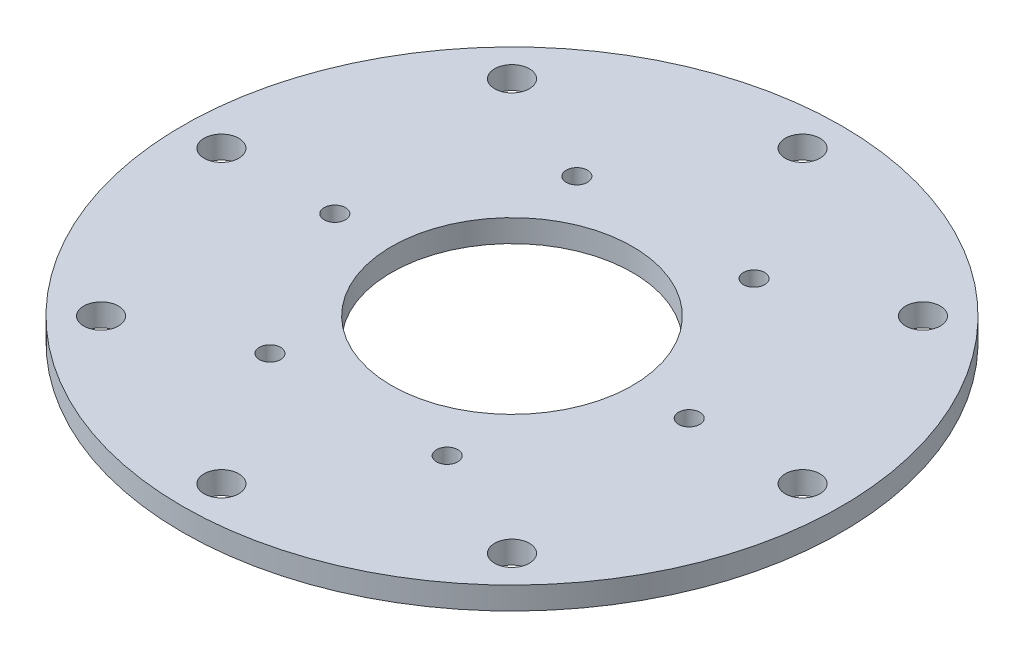
ISO-10303-21;
HEADER;
FILE_DESCRIPTION(('STEP AP214'),'2;1');
FILE_NAME('part.step','',(''),(''),'','','');
FILE_SCHEMA(('AUTOMOTIVE_DESIGN { 1 0 10303 214 1 1 1 1 }'));
ENDSEC;
DATA;
#1=APPLICATION_CONTEXT('core data for automotive mechanical design processes');
#2=APPLICATION_PROTOCOL_DEFINITION('international standard','automotive_design',2000,#1);
#3=PRODUCT_CONTEXT('',#1,'mechanical');
#4=PRODUCT('Part','Part','',(#3));
#5=PRODUCT_RELATED_PRODUCT_CATEGORY('part','',(#4));
#6=PRODUCT_DEFINITION_FORMATION('','',#4);
#7=PRODUCT_DEFINITION_CONTEXT('part definition',#1,'design');
#8=PRODUCT_DEFINITION('design','',#6,#7);
#9=PRODUCT_DEFINITION_SHAPE('','',#8);
#10=(LENGTH_UNIT() NAMED_UNIT(*) SI_UNIT(.MILLI.,.METRE.));
#11=(NAMED_UNIT(*) PLANE_ANGLE_UNIT() SI_UNIT($,.RADIAN.));
#12=(NAMED_UNIT(*) SI_UNIT($,.STERADIAN.) SOLID_ANGLE_UNIT());
#13=UNCERTAINTY_MEASURE_WITH_UNIT(LENGTH_MEASURE(1.E-05),#10,'distance_accuracy_value','');
#14=(GEOMETRIC_REPRESENTATION_CONTEXT(3) GLOBAL_UNCERTAINTY_ASSIGNED_CONTEXT((#13)) GLOBAL_UNIT_ASSIGNED_CONTEXT((#10,
#11,#12)) REPRESENTATION_CONTEXT('',''));
#15=CARTESIAN_POINT('',(0.,0.,0.));
#16=DIRECTION('',(0.,0.,1.));
#17=DIRECTION('',(1.,0.,0.));
#18=AXIS2_PLACEMENT_3D('',#15,#16,#17);
#19=CARTESIAN_POINT('',(0.,3.175,0.));
#20=DIRECTION('',(0.,1.,0.));
#21=DIRECTION('',(0.,0.,1.));
#22=AXIS2_PLACEMENT_3D('',#19,#20,#21);
#23=PLANE('',#22);
#24=CARTESIAN_POINT('',(-4.23328039289572E-13,3.175,41.));
#25=DIRECTION('',(0.,1.,0.));
#26=DIRECTION('',(0.,0.,1.));
#27=AXIS2_PLACEMENT_3D('',#24,#25,#26);
#28=CIRCLE('',#27,2.45);
#29=CARTESIAN_POINT('',(-4.23328039289572E-13,3.175,43.45));
#30=VERTEX_POINT('',#29);
#31=EDGE_CURVE('E122',#30,#30,#28,.T.);
#32=ORIENTED_EDGE('',*,*,#31,.F.);
#33=EDGE_LOOP('',(#32));
#34=FACE_BOUND('',#33,.T.);
#35=CARTESIAN_POINT('',(41.,3.175,2.84494650060196E-13));
#36=DIRECTION('',(0.,1.,0.));
#37=DIRECTION('',(0.,0.,1.));
#38=AXIS2_PLACEMENT_3D('',#35,#36,#37);
#39=CIRCLE('',#38,2.45);
#40=CARTESIAN_POINT('',(41.,3.175,2.45000000000028));
#41=VERTEX_POINT('',#40);
#42=EDGE_CURVE('E110',#41,#41,#39,.T.);
#43=ORIENTED_EDGE('',*,*,#42,.F.);
#44=EDGE_LOOP('',(#43));
#45=FACE_BOUND('',#44,.T.);
#46=CARTESIAN_POINT('',(7.14706072102445E-13,3.175,-41.));
#47=DIRECTION('',(0.,1.,0.));
#48=DIRECTION('',(0.,0.,1.));
#49=AXIS2_PLACEMENT_3D('',#46,#47,#48);
#50=CIRCLE('',#49,2.45);
#51=CARTESIAN_POINT('',(7.14706072102445E-13,3.175,-38.55));
#52=VERTEX_POINT('',#51);
#53=EDGE_CURVE('E98',#52,#52,#50,.T.);
#54=ORIENTED_EDGE('',*,*,#53,.F.);
#55=EDGE_LOOP('',(#54));
#56=FACE_BOUND('',#55,.T.);
#57=CARTESIAN_POINT('',(12.4999999999998,3.175,21.6506350946111));
#58=DIRECTION('',(0.,1.,0.));
#59=DIRECTION('',(0.,0.,1.));
#60=AXIS2_PLACEMENT_3D('',#57,#58,#59);
#61=CIRCLE('',#60,1.5);
#62=CARTESIAN_POINT('',(12.4999999999998,3.175,23.1506350946111));
#63=VERTEX_POINT('',#62);
#64=EDGE_CURVE('E86',#63,#63,#61,.T.);
#65=ORIENTED_EDGE('',*,*,#64,.F.);
#66=EDGE_LOOP('',(#65));
#67=FACE_BOUND('',#66,.T.);
#68=CARTESIAN_POINT('',(12.5000000000001,3.175,-21.6506350946109));
#69=DIRECTION('',(0.,1.,0.));
#70=DIRECTION('',(0.,0.,1.));
#71=AXIS2_PLACEMENT_3D('',#68,#69,#70);
#72=CIRCLE('',#71,1.5);
#73=CARTESIAN_POINT('',(12.5000000000001,3.175,-20.1506350946109));
#74=VERTEX_POINT('',#73);
#75=EDGE_CURVE('E74',#74,#74,#72,.T.);
#76=ORIENTED_EDGE('',*,*,#75,.F.);
#77=EDGE_LOOP('',(#76));
#78=FACE_BOUND('',#77,.T.);
#79=CARTESIAN_POINT('',(-28.991378028648,3.175,-28.9913780286489));
#80=DIRECTION('',(0.,1.,0.));
#81=DIRECTION('',(0.,0.,1.));
#82=AXIS2_PLACEMENT_3D('',#79,#80,#81);
#83=CIRCLE('',#82,2.45);
#84=CARTESIAN_POINT('',(-28.991378028648,3.175,-26.5413780286489));
#85=VERTEX_POINT('',#84);
#86=EDGE_CURVE('E62',#85,#85,#83,.T.);
#87=ORIENTED_EDGE('',*,*,#86,.F.);
#88=EDGE_LOOP('',(#87));
#89=FACE_BOUND('',#88,.T.);
#90=CARTESIAN_POINT('',(-41.,3.175,0.));
#91=DIRECTION('',(0.,1.,0.));
#92=DIRECTION('',(0.,0.,1.));
#93=AXIS2_PLACEMENT_3D('',#90,#91,#92);
#94=CIRCLE('',#93,2.45);
#95=CARTESIAN_POINT('',(-41.,3.175,2.45));
#96=VERTEX_POINT('',#95);
#97=EDGE_CURVE('E50',#96,#96,#94,.T.);
#98=ORIENTED_EDGE('',*,*,#97,.F.);
#99=EDGE_LOOP('',(#98));
#100=FACE_BOUND('',#99,.T.);
#101=CARTESIAN_POINT('',(0.,3.175,0.));
#102=DIRECTION('',(0.,1.,0.));
#103=DIRECTION('',(0.,0.,1.));
#104=AXIS2_PLACEMENT_3D('',#101,#102,#103);
#105=CIRCLE('',#104,46.5);
#106=CARTESIAN_POINT('',(0.,3.175,46.5));
#107=VERTEX_POINT('',#106);
#108=EDGE_CURVE('E10',#107,#107,#105,.T.);
#109=ORIENTED_EDGE('',*,*,#108,.T.);
#110=EDGE_LOOP('',(#109));
#111=FACE_BOUND('',#110,.T.);
#112=CARTESIAN_POINT('',(0.,3.175,0.));
#113=DIRECTION('',(0.,1.,0.));
#114=DIRECTION('',(0.,0.,1.));
#115=AXIS2_PLACEMENT_3D('',#112,#113,#114);
#116=CIRCLE('',#115,17.);
#117=CARTESIAN_POINT('',(0.,3.175,17.));
#118=VERTEX_POINT('',#117);
#119=EDGE_CURVE('E45',#118,#118,#116,.T.);
#120=ORIENTED_EDGE('',*,*,#119,.F.);
#121=EDGE_LOOP('',(#120));
#122=FACE_BOUND('',#121,.T.);
#123=CARTESIAN_POINT('',(-25.,3.175,0.));
#124=DIRECTION('',(0.,1.,0.));
#125=DIRECTION('',(0.,0.,1.));
#126=AXIS2_PLACEMENT_3D('',#123,#124,#125);
#127=CIRCLE('',#126,1.5);
#128=CARTESIAN_POINT('',(-25.,3.175,1.5));
#129=VERTEX_POINT('',#128);
#130=EDGE_CURVE('E56',#129,#129,#127,.T.);
#131=ORIENTED_EDGE('',*,*,#130,.F.);
#132=EDGE_LOOP('',(#131));
#133=FACE_BOUND('',#132,.T.);
#134=CARTESIAN_POINT('',(-12.5,3.175,-21.650635094611));
#135=DIRECTION('',(0.,1.,0.));
#136=DIRECTION('',(0.,0.,1.));
#137=AXIS2_PLACEMENT_3D('',#134,#135,#136);
#138=CIRCLE('',#137,1.50000000000002);
#139=CARTESIAN_POINT('',(-12.5,3.175,-20.1506350946109));
#140=VERTEX_POINT('',#139);
#141=EDGE_CURVE('E68',#140,#140,#138,.T.);
#142=ORIENTED_EDGE('',*,*,#141,.F.);
#143=EDGE_LOOP('',(#142));
#144=FACE_BOUND('',#143,.T.);
#145=CARTESIAN_POINT('',(25.,3.175,1.74574066942157E-13));
#146=DIRECTION('',(0.,1.,0.));
#147=DIRECTION('',(0.,0.,1.));
#148=AXIS2_PLACEMENT_3D('',#145,#146,#147);
#149=CIRCLE('',#148,1.5);
#150=CARTESIAN_POINT('',(25.,3.175,1.50000000000018));
#151=VERTEX_POINT('',#150);
#152=EDGE_CURVE('E80',#151,#151,#149,.T.);
#153=ORIENTED_EDGE('',*,*,#152,.F.);
#154=EDGE_LOOP('',(#153));
#155=FACE_BOUND('',#154,.T.);
#156=CARTESIAN_POINT('',(-12.5,3.175,21.650635094611));
#157=DIRECTION('',(0.,1.,0.));
#158=DIRECTION('',(0.,0.,1.));
#159=AXIS2_PLACEMENT_3D('',#156,#157,#158);
#160=CIRCLE('',#159,1.50000000000009);
#161=CARTESIAN_POINT('',(-12.5,3.175,23.1506350946111));
#162=VERTEX_POINT('',#161);
#163=EDGE_CURVE('E92',#162,#162,#160,.T.);
#164=ORIENTED_EDGE('',*,*,#163,.F.);
#165=EDGE_LOOP('',(#164));
#166=FACE_BOUND('',#165,.T.);
#167=CARTESIAN_POINT('',(28.9913780286486,3.175,-28.9913780286483));
#168=DIRECTION('',(0.,1.,0.));
#169=DIRECTION('',(0.,0.,1.));
#170=AXIS2_PLACEMENT_3D('',#167,#168,#169);
#171=CIRCLE('',#170,2.44999999999999);
#172=CARTESIAN_POINT('',(28.9913780286486,3.175,-26.5413780286483));
#173=VERTEX_POINT('',#172);
#174=EDGE_CURVE('E104',#173,#173,#171,.T.);
#175=ORIENTED_EDGE('',*,*,#174,.F.);
#176=EDGE_LOOP('',(#175));
#177=FACE_BOUND('',#176,.T.);
#178=CARTESIAN_POINT('',(28.9913780286485,3.175,28.9913780286484));
#179=DIRECTION('',(0.,1.,0.));
#180=DIRECTION('',(0.,0.,1.));
#181=AXIS2_PLACEMENT_3D('',#178,#179,#180);
#182=CIRCLE('',#181,2.44999999999999);
#183=CARTESIAN_POINT('',(28.9913780286485,3.175,31.4413780286484));
#184=VERTEX_POINT('',#183);
#185=EDGE_CURVE('E116',#184,#184,#182,.T.);
#186=ORIENTED_EDGE('',*,*,#185,.F.);
#187=EDGE_LOOP('',(#186));
#188=FACE_BOUND('',#187,.T.);
#189=CARTESIAN_POINT('',(-28.9913780286488,3.175,28.9913780286481));
#190=DIRECTION('',(0.,1.,0.));
#191=DIRECTION('',(0.,0.,1.));
#192=AXIS2_PLACEMENT_3D('',#189,#190,#191);
#193=CIRCLE('',#192,2.45);
#194=CARTESIAN_POINT('',(-28.9913780286488,3.175,31.4413780286481));
#195=VERTEX_POINT('',#194);
#196=EDGE_CURVE('E128',#195,#195,#193,.T.);
#197=ORIENTED_EDGE('',*,*,#196,.F.);
#198=EDGE_LOOP('',(#197));
#199=FACE_BOUND('',#198,.T.);
#200=ADVANCED_FACE('F34',(#34,#45,#56,#67,#78,#89,#100,#111,#122,#133,#144,#155,#166,#177,#188,
#199),#23,.T.);
#201=CARTESIAN_POINT('',(0.,0.,0.));
#202=DIRECTION('',(0.,1.,0.));
#203=DIRECTION('',(0.,0.,1.));
#204=AXIS2_PLACEMENT_3D('',#201,#202,#203);
#205=PLANE('',#204);
#206=CARTESIAN_POINT('',(0.,0.,0.));
#207=DIRECTION('',(0.,1.,0.));
#208=DIRECTION('',(0.,0.,1.));
#209=AXIS2_PLACEMENT_3D('',#206,#207,#208);
#210=CIRCLE('',#209,46.5);
#211=CARTESIAN_POINT('',(0.,0.,46.5));
#212=VERTEX_POINT('',#211);
#213=EDGE_CURVE('E38',#212,#212,#210,.T.);
#214=ORIENTED_EDGE('',*,*,#213,.F.);
#215=EDGE_LOOP('',(#214));
#216=FACE_BOUND('',#215,.T.);
#217=CARTESIAN_POINT('',(0.,0.,0.));
#218=DIRECTION('',(0.,1.,0.));
#219=DIRECTION('',(0.,0.,1.));
#220=AXIS2_PLACEMENT_3D('',#217,#218,#219);
#221=CIRCLE('',#220,17.);
#222=CARTESIAN_POINT('',(0.,0.,17.));
#223=VERTEX_POINT('',#222);
#224=EDGE_CURVE('E47',#223,#223,#221,.T.);
#225=ORIENTED_EDGE('',*,*,#224,.T.);
#226=EDGE_LOOP('',(#225));
#227=FACE_BOUND('',#226,.T.);
#228=CARTESIAN_POINT('',(-41.,0.,0.));
#229=DIRECTION('',(0.,1.,0.));
#230=DIRECTION('',(0.,0.,1.));
#231=AXIS2_PLACEMENT_3D('',#228,#229,#230);
#232=CIRCLE('',#231,2.45);
#233=CARTESIAN_POINT('',(-41.,0.,2.45));
#234=VERTEX_POINT('',#233);
#235=EDGE_CURVE('E53',#234,#234,#232,.T.);
#236=ORIENTED_EDGE('',*,*,#235,.T.);
#237=EDGE_LOOP('',(#236));
#238=FACE_BOUND('',#237,.T.);
#239=CARTESIAN_POINT('',(-25.,0.,0.));
#240=DIRECTION('',(0.,1.,0.));
#241=DIRECTION('',(0.,0.,1.));
#242=AXIS2_PLACEMENT_3D('',#239,#240,#241);
#243=CIRCLE('',#242,1.5);
#244=CARTESIAN_POINT('',(-25.,0.,1.5));
#245=VERTEX_POINT('',#244);
#246=EDGE_CURVE('E59',#245,#245,#243,.T.);
#247=ORIENTED_EDGE('',*,*,#246,.T.);
#248=EDGE_LOOP('',(#247));
#249=FACE_BOUND('',#248,.T.);
#250=CARTESIAN_POINT('',(-28.991378028648,0.,-28.9913780286489));
#251=DIRECTION('',(0.,1.,0.));
#252=DIRECTION('',(0.,0.,1.));
#253=AXIS2_PLACEMENT_3D('',#250,#251,#252);
#254=CIRCLE('',#253,2.45);
#255=CARTESIAN_POINT('',(-28.991378028648,0.,-26.5413780286489));
#256=VERTEX_POINT('',#255);
#257=EDGE_CURVE('E65',#256,#256,#254,.T.);
#258=ORIENTED_EDGE('',*,*,#257,.T.);
#259=EDGE_LOOP('',(#258));
#260=FACE_BOUND('',#259,.T.);
#261=CARTESIAN_POINT('',(-12.5,0.,-21.650635094611));
#262=DIRECTION('',(0.,1.,0.));
#263=DIRECTION('',(0.,0.,1.));
#264=AXIS2_PLACEMENT_3D('',#261,#262,#263);
#265=CIRCLE('',#264,1.50000000000002);
#266=CARTESIAN_POINT('',(-12.5,0.,-20.1506350946109));
#267=VERTEX_POINT('',#266);
#268=EDGE_CURVE('E71',#267,#267,#265,.T.);
#269=ORIENTED_EDGE('',*,*,#268,.T.);
#270=EDGE_LOOP('',(#269));
#271=FACE_BOUND('',#270,.T.);
#272=CARTESIAN_POINT('',(12.5000000000001,0.,-21.6506350946109));
#273=DIRECTION('',(0.,1.,0.));
#274=DIRECTION('',(0.,0.,1.));
#275=AXIS2_PLACEMENT_3D('',#272,#273,#274);
#276=CIRCLE('',#275,1.5);
#277=CARTESIAN_POINT('',(12.5000000000001,0.,-20.1506350946109));
#278=VERTEX_POINT('',#277);
#279=EDGE_CURVE('E77',#278,#278,#276,.T.);
#280=ORIENTED_EDGE('',*,*,#279,.T.);
#281=EDGE_LOOP('',(#280));
#282=FACE_BOUND('',#281,.T.);
#283=CARTESIAN_POINT('',(25.,0.,1.74574066942157E-13));
#284=DIRECTION('',(0.,1.,0.));
#285=DIRECTION('',(0.,0.,1.));
#286=AXIS2_PLACEMENT_3D('',#283,#284,#285);
#287=CIRCLE('',#286,1.5);
#288=CARTESIAN_POINT('',(25.,0.,1.50000000000018));
#289=VERTEX_POINT('',#288);
#290=EDGE_CURVE('E83',#289,#289,#287,.T.);
#291=ORIENTED_EDGE('',*,*,#290,.T.);
#292=EDGE_LOOP('',(#291));
#293=FACE_BOUND('',#292,.T.);
#294=CARTESIAN_POINT('',(12.4999999999998,0.,21.6506350946111));
#295=DIRECTION('',(0.,1.,0.));
#296=DIRECTION('',(0.,0.,1.));
#297=AXIS2_PLACEMENT_3D('',#294,#295,#296);
#298=CIRCLE('',#297,1.5);
#299=CARTESIAN_POINT('',(12.4999999999998,0.,23.1506350946111));
#300=VERTEX_POINT('',#299);
#301=EDGE_CURVE('E89',#300,#300,#298,.T.);
#302=ORIENTED_EDGE('',*,*,#301,.T.);
#303=EDGE_LOOP('',(#302));
#304=FACE_BOUND('',#303,.T.);
#305=CARTESIAN_POINT('',(-12.5,0.,21.650635094611));
#306=DIRECTION('',(0.,1.,0.));
#307=DIRECTION('',(0.,0.,1.));
#308=AXIS2_PLACEMENT_3D('',#305,#306,#307);
#309=CIRCLE('',#308,1.50000000000009);
#310=CARTESIAN_POINT('',(-12.5,0.,23.1506350946111));
#311=VERTEX_POINT('',#310);
#312=EDGE_CURVE('E95',#311,#311,#309,.T.);
#313=ORIENTED_EDGE('',*,*,#312,.T.);
#314=EDGE_LOOP('',(#313));
#315=FACE_BOUND('',#314,.T.);
#316=CARTESIAN_POINT('',(7.14706072102445E-13,0.,-41.));
#317=DIRECTION('',(0.,1.,0.));
#318=DIRECTION('',(0.,0.,1.));
#319=AXIS2_PLACEMENT_3D('',#316,#317,#318);
#320=CIRCLE('',#319,2.45);
#321=CARTESIAN_POINT('',(7.14706072102445E-13,0.,-38.55));
#322=VERTEX_POINT('',#321);
#323=EDGE_CURVE('E101',#322,#322,#320,.T.);
#324=ORIENTED_EDGE('',*,*,#323,.T.);
#325=EDGE_LOOP('',(#324));
#326=FACE_BOUND('',#325,.T.);
#327=CARTESIAN_POINT('',(28.9913780286486,0.,-28.9913780286483));
#328=DIRECTION('',(0.,1.,0.));
#329=DIRECTION('',(0.,0.,1.));
#330=AXIS2_PLACEMENT_3D('',#327,#328,#329);
#331=CIRCLE('',#330,2.44999999999999);
#332=CARTESIAN_POINT('',(28.9913780286486,0.,-26.5413780286483));
#333=VERTEX_POINT('',#332);
#334=EDGE_CURVE('E107',#333,#333,#331,.T.);
#335=ORIENTED_EDGE('',*,*,#334,.T.);
#336=EDGE_LOOP('',(#335));
#337=FACE_BOUND('',#336,.T.);
#338=CARTESIAN_POINT('',(41.,0.,2.84494650060196E-13));
#339=DIRECTION('',(0.,1.,0.));
#340=DIRECTION('',(0.,0.,1.));
#341=AXIS2_PLACEMENT_3D('',#338,#339,#340);
#342=CIRCLE('',#341,2.45);
#343=CARTESIAN_POINT('',(41.,0.,2.45000000000028));
#344=VERTEX_POINT('',#343);
#345=EDGE_CURVE('E113',#344,#344,#342,.T.);
#346=ORIENTED_EDGE('',*,*,#345,.T.);
#347=EDGE_LOOP('',(#346));
#348=FACE_BOUND('',#347,.T.);
#349=CARTESIAN_POINT('',(28.9913780286485,0.,28.9913780286484));
#350=DIRECTION('',(0.,1.,0.));
#351=DIRECTION('',(0.,0.,1.));
#352=AXIS2_PLACEMENT_3D('',#349,#350,#351);
#353=CIRCLE('',#352,2.44999999999999);
#354=CARTESIAN_POINT('',(28.9913780286485,0.,31.4413780286484));
#355=VERTEX_POINT('',#354);
#356=EDGE_CURVE('E119',#355,#355,#353,.T.);
#357=ORIENTED_EDGE('',*,*,#356,.T.);
#358=EDGE_LOOP('',(#357));
#359=FACE_BOUND('',#358,.T.);
#360=CARTESIAN_POINT('',(-4.23328039289572E-13,0.,41.));
#361=DIRECTION('',(0.,1.,0.));
#362=DIRECTION('',(0.,0.,1.));
#363=AXIS2_PLACEMENT_3D('',#360,#361,#362);
#364=CIRCLE('',#363,2.45);
#365=CARTESIAN_POINT('',(-4.23328039289572E-13,0.,43.45));
#366=VERTEX_POINT('',#365);
#367=EDGE_CURVE('E125',#366,#366,#364,.T.);
#368=ORIENTED_EDGE('',*,*,#367,.T.);
#369=EDGE_LOOP('',(#368));
#370=FACE_BOUND('',#369,.T.);
#371=CARTESIAN_POINT('',(-28.9913780286488,0.,28.9913780286481));
#372=DIRECTION('',(0.,1.,0.));
#373=DIRECTION('',(0.,0.,1.));
#374=AXIS2_PLACEMENT_3D('',#371,#372,#373);
#375=CIRCLE('',#374,2.45);
#376=CARTESIAN_POINT('',(-28.9913780286488,0.,31.4413780286481));
#377=VERTEX_POINT('',#376);
#378=EDGE_CURVE('E131',#377,#377,#375,.T.);
#379=ORIENTED_EDGE('',*,*,#378,.T.);
#380=EDGE_LOOP('',(#379));
#381=FACE_BOUND('',#380,.T.);
#382=ADVANCED_FACE('F141',(#216,#227,#238,#249,#260,#271,#282,#293,#304,#315,#326,#337,#348,
#359,#370,#381),#205,.F.);
#383=CARTESIAN_POINT('',(0.,3.175,0.));
#384=DIRECTION('',(0.,-1.,0.));
#385=DIRECTION('',(0.,0.,-1.));
#386=AXIS2_PLACEMENT_3D('',#383,#384,#385);
#387=CYLINDRICAL_SURFACE('',#386,46.5);
#388=ORIENTED_EDGE('',*,*,#108,.F.);
#389=EDGE_LOOP('',(#388));
#390=FACE_BOUND('',#389,.T.);
#391=ORIENTED_EDGE('',*,*,#213,.T.);
#392=EDGE_LOOP('',(#391));
#393=FACE_BOUND('',#392,.T.);
#394=ADVANCED_FACE('F36',(#390,#393),#387,.T.);
#395=CARTESIAN_POINT('',(0.,3.175,0.));
#396=DIRECTION('',(0.,-1.,0.));
#397=DIRECTION('',(0.,0.,-1.));
#398=AXIS2_PLACEMENT_3D('',#395,#396,#397);
#399=CYLINDRICAL_SURFACE('',#398,17.);
#400=ORIENTED_EDGE('',*,*,#119,.T.);
#401=EDGE_LOOP('',(#400));
#402=FACE_BOUND('',#401,.T.);
#403=ORIENTED_EDGE('',*,*,#224,.F.);
#404=EDGE_LOOP('',(#403));
#405=FACE_BOUND('',#404,.T.);
#406=ADVANCED_FACE('F151',(#402,#405),#399,.F.);
#407=CARTESIAN_POINT('',(-41.,3.175,0.));
#408=DIRECTION('',(0.,-1.,0.));
#409=DIRECTION('',(0.,0.,-1.));
#410=AXIS2_PLACEMENT_3D('',#407,#408,#409);
#411=CYLINDRICAL_SURFACE('',#410,2.45);
#412=ORIENTED_EDGE('',*,*,#97,.T.);
#413=EDGE_LOOP('',(#412));
#414=FACE_BOUND('',#413,.T.);
#415=ORIENTED_EDGE('',*,*,#235,.F.);
#416=EDGE_LOOP('',(#415));
#417=FACE_BOUND('',#416,.T.);
#418=ADVANCED_FACE('F154',(#414,#417),#411,.F.);
#419=CARTESIAN_POINT('',(-25.,3.175,0.));
#420=DIRECTION('',(0.,-1.,0.));
#421=DIRECTION('',(0.,0.,-1.));
#422=AXIS2_PLACEMENT_3D('',#419,#420,#421);
#423=CYLINDRICAL_SURFACE('',#422,1.5);
#424=ORIENTED_EDGE('',*,*,#130,.T.);
#425=EDGE_LOOP('',(#424));
#426=FACE_BOUND('',#425,.T.);
#427=ORIENTED_EDGE('',*,*,#246,.F.);
#428=EDGE_LOOP('',(#427));
#429=FACE_BOUND('',#428,.T.);
#430=ADVANCED_FACE('F158',(#426,#429),#423,.F.);
#431=CARTESIAN_POINT('',(-28.991378028648,3.175,-28.9913780286489));
#432=DIRECTION('',(0.,-1.,0.));
#433=DIRECTION('',(0.,0.,-1.));
#434=AXIS2_PLACEMENT_3D('',#431,#432,#433);
#435=CYLINDRICAL_SURFACE('',#434,2.45);
#436=ORIENTED_EDGE('',*,*,#86,.T.);
#437=EDGE_LOOP('',(#436));
#438=FACE_BOUND('',#437,.T.);
#439=ORIENTED_EDGE('',*,*,#257,.F.);
#440=EDGE_LOOP('',(#439));
#441=FACE_BOUND('',#440,.T.);
#442=ADVANCED_FACE('F162',(#438,#441),#435,.F.);
#443=CARTESIAN_POINT('',(-12.5,3.175,-21.650635094611));
#444=DIRECTION('',(0.,-1.,0.));
#445=DIRECTION('',(0.,0.,-1.));
#446=AXIS2_PLACEMENT_3D('',#443,#444,#445);
#447=CYLINDRICAL_SURFACE('',#446,1.50000000000002);
#448=ORIENTED_EDGE('',*,*,#141,.T.);
#449=EDGE_LOOP('',(#448));
#450=FACE_BOUND('',#449,.T.);
#451=ORIENTED_EDGE('',*,*,#268,.F.);
#452=EDGE_LOOP('',(#451));
#453=FACE_BOUND('',#452,.T.);
#454=ADVANCED_FACE('F166',(#450,#453),#447,.F.);
#455=CARTESIAN_POINT('',(12.5000000000001,3.175,-21.6506350946109));
#456=DIRECTION('',(0.,-1.,0.));
#457=DIRECTION('',(0.,0.,-1.));
#458=AXIS2_PLACEMENT_3D('',#455,#456,#457);
#459=CYLINDRICAL_SURFACE('',#458,1.5);
#460=ORIENTED_EDGE('',*,*,#75,.T.);
#461=EDGE_LOOP('',(#460));
#462=FACE_BOUND('',#461,.T.);
#463=ORIENTED_EDGE('',*,*,#279,.F.);
#464=EDGE_LOOP('',(#463));
#465=FACE_BOUND('',#464,.T.);
#466=ADVANCED_FACE('F170',(#462,#465),#459,.F.);
#467=CARTESIAN_POINT('',(25.,3.175,1.74574066942157E-13));
#468=DIRECTION('',(0.,-1.,0.));
#469=DIRECTION('',(0.,0.,-1.));
#470=AXIS2_PLACEMENT_3D('',#467,#468,#469);
#471=CYLINDRICAL_SURFACE('',#470,1.5);
#472=ORIENTED_EDGE('',*,*,#152,.T.);
#473=EDGE_LOOP('',(#472));
#474=FACE_BOUND('',#473,.T.);
#475=ORIENTED_EDGE('',*,*,#290,.F.);
#476=EDGE_LOOP('',(#475));
#477=FACE_BOUND('',#476,.T.);
#478=ADVANCED_FACE('F174',(#474,#477),#471,.F.);
#479=CARTESIAN_POINT('',(12.4999999999998,3.175,21.6506350946111));
#480=DIRECTION('',(0.,-1.,0.));
#481=DIRECTION('',(0.,0.,-1.));
#482=AXIS2_PLACEMENT_3D('',#479,#480,#481);
#483=CYLINDRICAL_SURFACE('',#482,1.5);
#484=ORIENTED_EDGE('',*,*,#64,.T.);
#485=EDGE_LOOP('',(#484));
#486=FACE_BOUND('',#485,.T.);
#487=ORIENTED_EDGE('',*,*,#301,.F.);
#488=EDGE_LOOP('',(#487));
#489=FACE_BOUND('',#488,.T.);
#490=ADVANCED_FACE('F178',(#486,#489),#483,.F.);
#491=CARTESIAN_POINT('',(-12.5,3.175,21.650635094611));
#492=DIRECTION('',(0.,-1.,0.));
#493=DIRECTION('',(0.,0.,-1.));
#494=AXIS2_PLACEMENT_3D('',#491,#492,#493);
#495=CYLINDRICAL_SURFACE('',#494,1.50000000000009);
#496=ORIENTED_EDGE('',*,*,#163,.T.);
#497=EDGE_LOOP('',(#496));
#498=FACE_BOUND('',#497,.T.);
#499=ORIENTED_EDGE('',*,*,#312,.F.);
#500=EDGE_LOOP('',(#499));
#501=FACE_BOUND('',#500,.T.);
#502=ADVANCED_FACE('F182',(#498,#501),#495,.F.);
#503=CARTESIAN_POINT('',(7.14706072102445E-13,3.175,-41.));
#504=DIRECTION('',(0.,-1.,0.));
#505=DIRECTION('',(0.,0.,-1.));
#506=AXIS2_PLACEMENT_3D('',#503,#504,#505);
#507=CYLINDRICAL_SURFACE('',#506,2.45);
#508=ORIENTED_EDGE('',*,*,#53,.T.);
#509=EDGE_LOOP('',(#508));
#510=FACE_BOUND('',#509,.T.);
#511=ORIENTED_EDGE('',*,*,#323,.F.);
#512=EDGE_LOOP('',(#511));
#513=FACE_BOUND('',#512,.T.);
#514=ADVANCED_FACE('F186',(#510,#513),#507,.F.);
#515=CARTESIAN_POINT('',(28.9913780286486,3.175,-28.9913780286483));
#516=DIRECTION('',(0.,-1.,0.));
#517=DIRECTION('',(0.,0.,-1.));
#518=AXIS2_PLACEMENT_3D('',#515,#516,#517);
#519=CYLINDRICAL_SURFACE('',#518,2.44999999999999);
#520=ORIENTED_EDGE('',*,*,#174,.T.);
#521=EDGE_LOOP('',(#520));
#522=FACE_BOUND('',#521,.T.);
#523=ORIENTED_EDGE('',*,*,#334,.F.);
#524=EDGE_LOOP('',(#523));
#525=FACE_BOUND('',#524,.T.);
#526=ADVANCED_FACE('F190',(#522,#525),#519,.F.);
#527=CARTESIAN_POINT('',(41.,3.175,2.84494650060196E-13));
#528=DIRECTION('',(0.,-1.,0.));
#529=DIRECTION('',(0.,0.,-1.));
#530=AXIS2_PLACEMENT_3D('',#527,#528,#529);
#531=CYLINDRICAL_SURFACE('',#530,2.45);
#532=ORIENTED_EDGE('',*,*,#42,.T.);
#533=EDGE_LOOP('',(#532));
#534=FACE_BOUND('',#533,.T.);
#535=ORIENTED_EDGE('',*,*,#345,.F.);
#536=EDGE_LOOP('',(#535));
#537=FACE_BOUND('',#536,.T.);
#538=ADVANCED_FACE('F194',(#534,#537),#531,.F.);
#539=CARTESIAN_POINT('',(28.9913780286485,3.175,28.9913780286484));
#540=DIRECTION('',(0.,-1.,0.));
#541=DIRECTION('',(0.,0.,-1.));
#542=AXIS2_PLACEMENT_3D('',#539,#540,#541);
#543=CYLINDRICAL_SURFACE('',#542,2.44999999999999);
#544=ORIENTED_EDGE('',*,*,#185,.T.);
#545=EDGE_LOOP('',(#544));
#546=FACE_BOUND('',#545,.T.);
#547=ORIENTED_EDGE('',*,*,#356,.F.);
#548=EDGE_LOOP('',(#547));
#549=FACE_BOUND('',#548,.T.);
#550=ADVANCED_FACE('F198',(#546,#549),#543,.F.);
#551=CARTESIAN_POINT('',(-4.23328039289572E-13,3.175,41.));
#552=DIRECTION('',(0.,-1.,0.));
#553=DIRECTION('',(0.,0.,-1.));
#554=AXIS2_PLACEMENT_3D('',#551,#552,#553);
#555=CYLINDRICAL_SURFACE('',#554,2.45);
#556=ORIENTED_EDGE('',*,*,#31,.T.);
#557=EDGE_LOOP('',(#556));
#558=FACE_BOUND('',#557,.T.);
#559=ORIENTED_EDGE('',*,*,#367,.F.);
#560=EDGE_LOOP('',(#559));
#561=FACE_BOUND('',#560,.T.);
#562=ADVANCED_FACE('F202',(#558,#561),#555,.F.);
#563=CARTESIAN_POINT('',(-28.9913780286488,3.175,28.9913780286481));
#564=DIRECTION('',(0.,-1.,0.));
#565=DIRECTION('',(0.,0.,-1.));
#566=AXIS2_PLACEMENT_3D('',#563,#564,#565);
#567=CYLINDRICAL_SURFACE('',#566,2.45);
#568=ORIENTED_EDGE('',*,*,#196,.T.);
#569=EDGE_LOOP('',(#568));
#570=FACE_BOUND('',#569,.T.);
#571=ORIENTED_EDGE('',*,*,#378,.F.);
#572=EDGE_LOOP('',(#571));
#573=FACE_BOUND('',#572,.T.);
#574=ADVANCED_FACE('F137',(#570,#573),#567,.F.);
#575=CLOSED_SHELL('',(#200,#382,#394,#406,#418,#430,#442,#454,#466,#478,#490,#502,#514,#526,
#538,#550,#562,#574));
#576=MANIFOLD_SOLID_BREP('B2',#575);
#577=ADVANCED_BREP_SHAPE_REPRESENTATION('',(#18,#576),#14);
#578=SHAPE_DEFINITION_REPRESENTATION(#9,#577);
ENDSEC;
END-ISO-10303-21;
